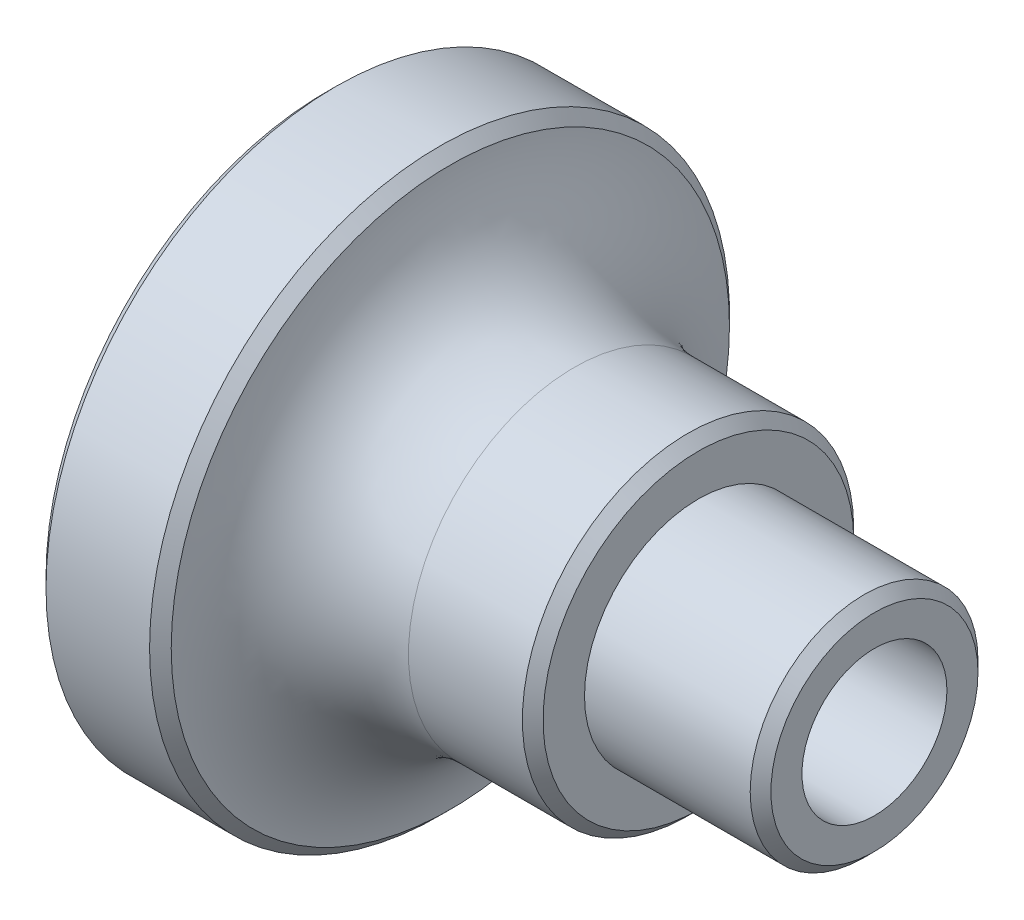
ISO-10303-21;
HEADER;
FILE_DESCRIPTION(('STEP AP214'),'2;1');
FILE_NAME('part.step','',(''),(''),'','','');
FILE_SCHEMA(('AUTOMOTIVE_DESIGN { 1 0 10303 214 1 1 1 1 }'));
ENDSEC;
DATA;
#1=APPLICATION_CONTEXT('core data for automotive mechanical design processes');
#2=APPLICATION_PROTOCOL_DEFINITION('international standard','automotive_design',2000,#1);
#3=PRODUCT_CONTEXT('',#1,'mechanical');
#4=PRODUCT('Part','Part','',(#3));
#5=PRODUCT_RELATED_PRODUCT_CATEGORY('part','',(#4));
#6=PRODUCT_DEFINITION_FORMATION('','',#4);
#7=PRODUCT_DEFINITION_CONTEXT('part definition',#1,'design');
#8=PRODUCT_DEFINITION('design','',#6,#7);
#9=PRODUCT_DEFINITION_SHAPE('','',#8);
#10=(LENGTH_UNIT() NAMED_UNIT(*) SI_UNIT(.MILLI.,.METRE.));
#11=(NAMED_UNIT(*) PLANE_ANGLE_UNIT() SI_UNIT($,.RADIAN.));
#12=(NAMED_UNIT(*) SI_UNIT($,.STERADIAN.) SOLID_ANGLE_UNIT());
#13=UNCERTAINTY_MEASURE_WITH_UNIT(LENGTH_MEASURE(1.E-05),#10,'distance_accuracy_value','');
#14=(GEOMETRIC_REPRESENTATION_CONTEXT(3) GLOBAL_UNCERTAINTY_ASSIGNED_CONTEXT((#13)) GLOBAL_UNIT_ASSIGNED_CONTEXT((#10,
#11,#12)) REPRESENTATION_CONTEXT('',''));
#15=CARTESIAN_POINT('',(0.,0.,0.));
#16=DIRECTION('',(0.,0.,1.));
#17=DIRECTION('',(1.,0.,0.));
#18=AXIS2_PLACEMENT_3D('',#15,#16,#17);
#19=CARTESIAN_POINT('',(0.,0.,0.));
#20=DIRECTION('',(1.,0.,0.));
#21=DIRECTION('',(0.,0.,-1.));
#22=AXIS2_PLACEMENT_3D('',#19,#20,#21);
#23=PLANE('',#22);
#24=CARTESIAN_POINT('',(0.,0.,0.));
#25=DIRECTION('',(1.,0.,0.));
#26=DIRECTION('',(0.,0.,-1.));
#27=AXIS2_PLACEMENT_3D('',#24,#25,#26);
#28=CIRCLE('',#27,2.);
#29=CARTESIAN_POINT('',(0.,0.,-2.));
#30=VERTEX_POINT('',#29);
#31=EDGE_CURVE('E77',#30,#30,#28,.T.);
#32=ORIENTED_EDGE('',*,*,#31,.T.);
#33=EDGE_LOOP('',(#32));
#34=FACE_BOUND('',#33,.T.);
#35=CARTESIAN_POINT('',(0.,0.,0.));
#36=DIRECTION('',(1.,0.,0.));
#37=DIRECTION('',(0.,0.,-1.));
#38=AXIS2_PLACEMENT_3D('',#35,#36,#37);
#39=CIRCLE('',#38,6.75);
#40=CARTESIAN_POINT('',(0.,0.,-6.75));
#41=VERTEX_POINT('',#40);
#42=EDGE_CURVE('E79',#41,#41,#39,.F.);
#43=ORIENTED_EDGE('',*,*,#42,.T.);
#44=EDGE_LOOP('',(#43));
#45=FACE_BOUND('',#44,.T.);
#46=ADVANCED_FACE('F43',(#34,#45),#23,.F.);
#47=CARTESIAN_POINT('',(3.,0.,0.));
#48=DIRECTION('',(-1.,0.,0.));
#49=DIRECTION('',(0.,0.,1.));
#50=AXIS2_PLACEMENT_3D('',#47,#48,#49);
#51=CYLINDRICAL_SURFACE('',#50,7.);
#52=CARTESIAN_POINT('',(0.250000000000003,0.,0.));
#53=DIRECTION('',(1.,0.,0.));
#54=DIRECTION('',(0.,0.,-1.));
#55=AXIS2_PLACEMENT_3D('',#52,#53,#54);
#56=CIRCLE('',#55,7.);
#57=CARTESIAN_POINT('',(0.250000000000003,0.,-7.));
#58=VERTEX_POINT('',#57);
#59=EDGE_CURVE('E66',#58,#58,#56,.T.);
#60=ORIENTED_EDGE('',*,*,#59,.T.);
#61=EDGE_LOOP('',(#60));
#62=FACE_BOUND('',#61,.T.);
#63=CARTESIAN_POINT('',(2.75,0.,0.));
#64=DIRECTION('',(-1.,0.,0.));
#65=DIRECTION('',(0.,0.,1.));
#66=AXIS2_PLACEMENT_3D('',#63,#64,#65);
#67=CIRCLE('',#66,7.);
#68=CARTESIAN_POINT('',(2.75,0.,7.));
#69=VERTEX_POINT('',#68);
#70=EDGE_CURVE('E67',#69,#69,#67,.T.);
#71=ORIENTED_EDGE('',*,*,#70,.T.);
#72=EDGE_LOOP('',(#71));
#73=FACE_BOUND('',#72,.T.);
#74=ADVANCED_FACE('F109',(#62,#73),#51,.T.);
#75=CARTESIAN_POINT('',(3.,0.,0.));
#76=DIRECTION('',(-1.,0.,0.));
#77=DIRECTION('',(0.,0.,1.));
#78=AXIS2_PLACEMENT_3D('',#75,#76,#77);
#79=CYLINDRICAL_SURFACE('',#78,1.75);
#80=CARTESIAN_POINT('',(0.250000000000005,0.,0.));
#81=DIRECTION('',(1.,0.,0.));
#82=DIRECTION('',(0.,0.,-1.));
#83=AXIS2_PLACEMENT_3D('',#80,#81,#82);
#84=CIRCLE('',#83,1.75);
#85=CARTESIAN_POINT('',(0.250000000000005,0.,-1.75));
#86=VERTEX_POINT('',#85);
#87=EDGE_CURVE('E71',#86,#86,#84,.F.);
#88=ORIENTED_EDGE('',*,*,#87,.T.);
#89=EDGE_LOOP('',(#88));
#90=FACE_BOUND('',#89,.T.);
#91=CARTESIAN_POINT('',(13.25,0.,0.));
#92=DIRECTION('',(1.,0.,0.));
#93=DIRECTION('',(0.,0.,-1.));
#94=AXIS2_PLACEMENT_3D('',#91,#92,#93);
#95=CIRCLE('',#94,1.75);
#96=CARTESIAN_POINT('',(13.25,0.,-1.75));
#97=VERTEX_POINT('',#96);
#98=EDGE_CURVE('E89',#97,#97,#95,.T.);
#99=ORIENTED_EDGE('',*,*,#98,.T.);
#100=EDGE_LOOP('',(#99));
#101=FACE_BOUND('',#100,.T.);
#102=ADVANCED_FACE('F95',(#90,#101),#79,.F.);
#103=CARTESIAN_POINT('',(29.3137084989848,0.,0.));
#104=DIRECTION('',(-1.,0.,0.));
#105=DIRECTION('',(0.,0.,1.));
#106=AXIS2_PLACEMENT_3D('',#103,#104,#105);
#107=CYLINDRICAL_SURFACE('',#106,4.);
#108=CARTESIAN_POINT('',(8.75,0.,0.));
#109=DIRECTION('',(1.,0.,0.));
#110=DIRECTION('',(0.,0.,-1.));
#111=AXIS2_PLACEMENT_3D('',#108,#109,#110);
#112=CIRCLE('',#111,4.);
#113=CARTESIAN_POINT('',(8.75,0.,-4.));
#114=VERTEX_POINT('',#113);
#115=EDGE_CURVE('E51',#114,#114,#112,.F.);
#116=ORIENTED_EDGE('',*,*,#115,.T.);
#117=EDGE_LOOP('',(#116));
#118=FACE_BOUND('',#117,.T.);
#119=CARTESIAN_POINT('',(6.,0.,0.));
#120=DIRECTION('',(1.,0.,0.));
#121=DIRECTION('',(0.,0.,-1.));
#122=AXIS2_PLACEMENT_3D('',#119,#120,#121);
#123=CIRCLE('',#122,4.);
#124=CARTESIAN_POINT('',(6.,0.,-4.));
#125=VERTEX_POINT('',#124);
#126=EDGE_CURVE('E84',#125,#125,#123,.T.);
#127=ORIENTED_EDGE('',*,*,#126,.T.);
#128=EDGE_LOOP('',(#127));
#129=FACE_BOUND('',#128,.T.);
#130=ADVANCED_FACE('F158',(#118,#129),#107,.T.);
#131=CARTESIAN_POINT('',(9.,0.,0.));
#132=DIRECTION('',(1.,0.,0.));
#133=DIRECTION('',(0.,0.,-1.));
#134=AXIS2_PLACEMENT_3D('',#131,#132,#133);
#135=PLANE('',#134);
#136=CARTESIAN_POINT('',(9.,0.,0.));
#137=DIRECTION('',(1.,0.,0.));
#138=DIRECTION('',(0.,0.,-1.));
#139=AXIS2_PLACEMENT_3D('',#136,#137,#138);
#140=CIRCLE('',#139,3.74999999999999);
#141=CARTESIAN_POINT('',(9.,0.,-3.74999999999999));
#142=VERTEX_POINT('',#141);
#143=EDGE_CURVE('E54',#142,#142,#140,.T.);
#144=ORIENTED_EDGE('',*,*,#143,.T.);
#145=EDGE_LOOP('',(#144));
#146=FACE_BOUND('',#145,.T.);
#147=CARTESIAN_POINT('',(9.,0.,0.));
#148=DIRECTION('',(1.,0.,0.));
#149=DIRECTION('',(0.,0.,-1.));
#150=AXIS2_PLACEMENT_3D('',#147,#148,#149);
#151=CIRCLE('',#150,2.75);
#152=CARTESIAN_POINT('',(9.,0.,-2.75));
#153=VERTEX_POINT('',#152);
#154=EDGE_CURVE('E85',#153,#153,#151,.T.);
#155=ORIENTED_EDGE('',*,*,#154,.F.);
#156=EDGE_LOOP('',(#155));
#157=FACE_BOUND('',#156,.T.);
#158=ADVANCED_FACE('F110',(#146,#157),#135,.T.);
#159=CARTESIAN_POINT('',(6.,0.,0.));
#160=DIRECTION('',(1.,0.,0.));
#161=DIRECTION('',(0.,0.,-1.));
#162=AXIS2_PLACEMENT_3D('',#159,#160,#161);
#163=TOROIDAL_SURFACE('',#162,7.,3.);
#164=CARTESIAN_POINT('',(3.0114109856705,0.,0.));
#165=DIRECTION('',(1.,0.,0.));
#166=DIRECTION('',(0.,0.,-1.));
#167=AXIS2_PLACEMENT_3D('',#164,#165,#166);
#168=CIRCLE('',#167,6.73858901432946);
#169=CARTESIAN_POINT('',(3.0114109856705,0.,-6.73858901432946));
#170=VERTEX_POINT('',#169);
#171=EDGE_CURVE('E11',#170,#170,#168,.T.);
#172=ORIENTED_EDGE('',*,*,#171,.T.);
#173=EDGE_LOOP('',(#172));
#174=FACE_BOUND('',#173,.T.);
#175=ORIENTED_EDGE('',*,*,#126,.F.);
#176=EDGE_LOOP('',(#175));
#177=FACE_BOUND('',#176,.T.);
#178=ADVANCED_FACE('F97',(#174,#177),#163,.F.);
#179=CARTESIAN_POINT('',(13.25,0.,0.));
#180=DIRECTION('',(1.,0.,0.));
#181=DIRECTION('',(0.,0.,-1.));
#182=AXIS2_PLACEMENT_3D('',#179,#180,#181);
#183=PLANE('',#182);
#184=CARTESIAN_POINT('',(13.25,0.,0.));
#185=DIRECTION('',(1.,0.,0.));
#186=DIRECTION('',(0.,0.,-1.));
#187=AXIS2_PLACEMENT_3D('',#184,#185,#186);
#188=CIRCLE('',#187,2.5);
#189=CARTESIAN_POINT('',(13.25,0.,-2.5));
#190=VERTEX_POINT('',#189);
#191=EDGE_CURVE('E61',#190,#190,#188,.T.);
#192=ORIENTED_EDGE('',*,*,#191,.T.);
#193=EDGE_LOOP('',(#192));
#194=FACE_BOUND('',#193,.T.);
#195=ORIENTED_EDGE('',*,*,#98,.F.);
#196=EDGE_LOOP('',(#195));
#197=FACE_BOUND('',#196,.T.);
#198=ADVANCED_FACE('F94',(#194,#197),#183,.T.);
#199=CARTESIAN_POINT('',(13.25,0.,0.));
#200=DIRECTION('',(-1.,0.,0.));
#201=DIRECTION('',(0.,0.,1.));
#202=AXIS2_PLACEMENT_3D('',#199,#200,#201);
#203=CYLINDRICAL_SURFACE('',#202,2.75);
#204=CARTESIAN_POINT('',(13.,0.,0.));
#205=DIRECTION('',(1.,0.,0.));
#206=DIRECTION('',(0.,0.,-1.));
#207=AXIS2_PLACEMENT_3D('',#204,#205,#206);
#208=CIRCLE('',#207,2.75);
#209=CARTESIAN_POINT('',(13.,0.,-2.75));
#210=VERTEX_POINT('',#209);
#211=EDGE_CURVE('E56',#210,#210,#208,.F.);
#212=ORIENTED_EDGE('',*,*,#211,.T.);
#213=EDGE_LOOP('',(#212));
#214=FACE_BOUND('',#213,.T.);
#215=ORIENTED_EDGE('',*,*,#154,.T.);
#216=EDGE_LOOP('',(#215));
#217=FACE_BOUND('',#216,.T.);
#218=ADVANCED_FACE('F98',(#214,#217),#203,.T.);
#219=CARTESIAN_POINT('',(0.,0.,0.));
#220=DIRECTION('',(-1.,0.,0.));
#221=DIRECTION('',(0.,0.,1.));
#222=AXIS2_PLACEMENT_3D('',#219,#220,#221);
#223=CONICAL_SURFACE('',#222,2.,0.785398163397446);
#224=ORIENTED_EDGE('',*,*,#87,.F.);
#225=EDGE_LOOP('',(#224));
#226=FACE_BOUND('',#225,.T.);
#227=ORIENTED_EDGE('',*,*,#31,.F.);
#228=EDGE_LOOP('',(#227));
#229=FACE_BOUND('',#228,.T.);
#230=ADVANCED_FACE('F104',(#226,#229),#223,.F.);
#231=CARTESIAN_POINT('',(0.250000000000003,0.,0.));
#232=DIRECTION('',(1.,0.,0.));
#233=DIRECTION('',(0.,0.,-1.));
#234=AXIS2_PLACEMENT_3D('',#231,#232,#233);
#235=CONICAL_SURFACE('',#234,7.,0.785398163397448);
#236=ORIENTED_EDGE('',*,*,#42,.F.);
#237=EDGE_LOOP('',(#236));
#238=FACE_BOUND('',#237,.T.);
#239=ORIENTED_EDGE('',*,*,#59,.F.);
#240=EDGE_LOOP('',(#239));
#241=FACE_BOUND('',#240,.T.);
#242=ADVANCED_FACE('F129',(#238,#241),#235,.T.);
#243=CARTESIAN_POINT('',(13.25,0.,0.));
#244=DIRECTION('',(-1.,0.,0.));
#245=DIRECTION('',(0.,0.,1.));
#246=AXIS2_PLACEMENT_3D('',#243,#244,#245);
#247=CONICAL_SURFACE('',#246,2.5,0.78539816339744);
#248=ORIENTED_EDGE('',*,*,#211,.F.);
#249=EDGE_LOOP('',(#248));
#250=FACE_BOUND('',#249,.T.);
#251=ORIENTED_EDGE('',*,*,#191,.F.);
#252=EDGE_LOOP('',(#251));
#253=FACE_BOUND('',#252,.T.);
#254=ADVANCED_FACE('F132',(#250,#253),#247,.T.);
#255=CARTESIAN_POINT('',(9.,0.,0.));
#256=DIRECTION('',(-1.,0.,0.));
#257=DIRECTION('',(0.,0.,1.));
#258=AXIS2_PLACEMENT_3D('',#255,#256,#257);
#259=CONICAL_SURFACE('',#258,3.75,0.785398163397455);
#260=ORIENTED_EDGE('',*,*,#115,.F.);
#261=EDGE_LOOP('',(#260));
#262=FACE_BOUND('',#261,.T.);
#263=ORIENTED_EDGE('',*,*,#143,.F.);
#264=EDGE_LOOP('',(#263));
#265=FACE_BOUND('',#264,.T.);
#266=ADVANCED_FACE('F142',(#262,#265),#259,.T.);
#267=CARTESIAN_POINT('',(3.01141098567054,0.,0.));
#268=DIRECTION('',(-1.,0.,0.));
#269=DIRECTION('',(0.,0.,1.));
#270=AXIS2_PLACEMENT_3D('',#267,#268,#269);
#271=CONICAL_SURFACE('',#270,6.73858901432947,0.785398163397448);
#272=ORIENTED_EDGE('',*,*,#70,.F.);
#273=EDGE_LOOP('',(#272));
#274=FACE_BOUND('',#273,.T.);
#275=ORIENTED_EDGE('',*,*,#171,.F.);
#276=EDGE_LOOP('',(#275));
#277=FACE_BOUND('',#276,.T.);
#278=ADVANCED_FACE('F46',(#274,#277),#271,.T.);
#279=CLOSED_SHELL('',(#46,#74,#102,#130,#158,#178,#198,#218,#230,#242,#254,#266,#278));
#280=MANIFOLD_SOLID_BREP('B2',#279);
#281=ADVANCED_BREP_SHAPE_REPRESENTATION('',(#18,#280),#14);
#282=SHAPE_DEFINITION_REPRESENTATION(#9,#281);
ENDSEC;
END-ISO-10303-21;
